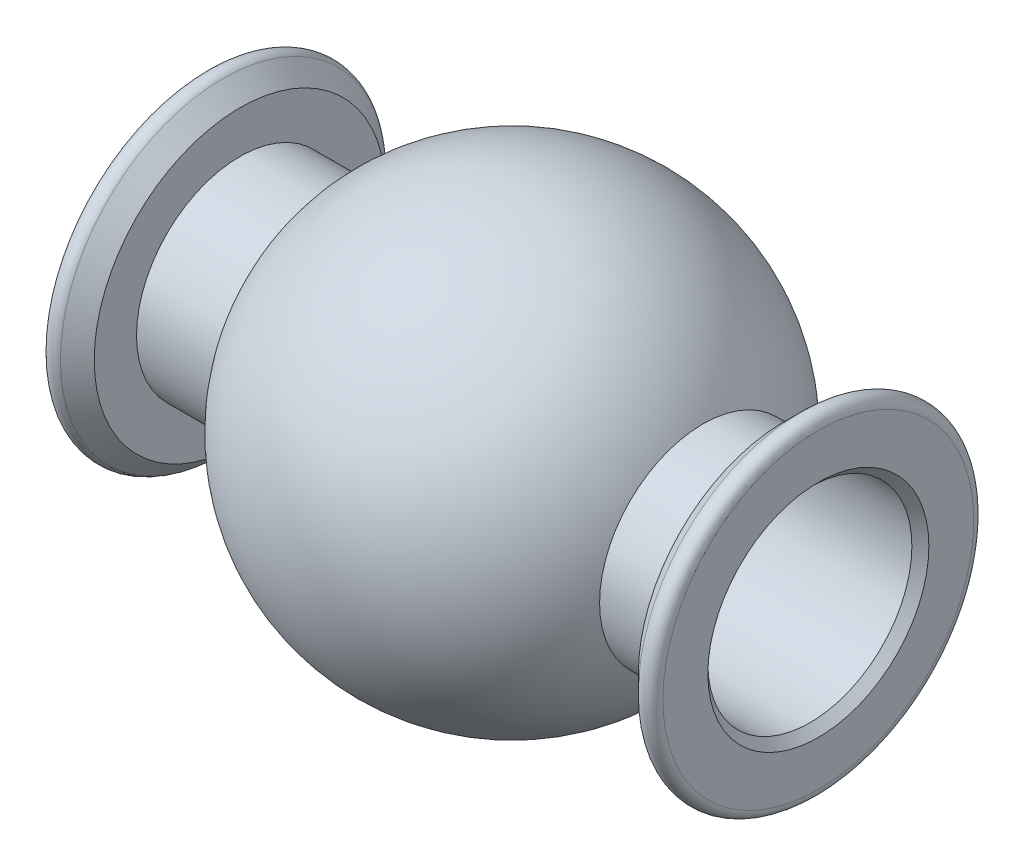
ISO-10303-21;
HEADER;
FILE_DESCRIPTION(('STEP AP214'),'2;1');
FILE_NAME('part.step','',(''),(''),'','','');
FILE_SCHEMA(('AUTOMOTIVE_DESIGN { 1 0 10303 214 1 1 1 1 }'));
ENDSEC;
DATA;
#1=APPLICATION_CONTEXT('core data for automotive mechanical design processes');
#2=APPLICATION_PROTOCOL_DEFINITION('international standard','automotive_design',2000,#1);
#3=PRODUCT_CONTEXT('',#1,'mechanical');
#4=PRODUCT('Part','Part','',(#3));
#5=PRODUCT_RELATED_PRODUCT_CATEGORY('part','',(#4));
#6=PRODUCT_DEFINITION_FORMATION('','',#4);
#7=PRODUCT_DEFINITION_CONTEXT('part definition',#1,'design');
#8=PRODUCT_DEFINITION('design','',#6,#7);
#9=PRODUCT_DEFINITION_SHAPE('','',#8);
#10=(LENGTH_UNIT() NAMED_UNIT(*) SI_UNIT(.MILLI.,.METRE.));
#11=(NAMED_UNIT(*) PLANE_ANGLE_UNIT() SI_UNIT($,.RADIAN.));
#12=(NAMED_UNIT(*) SI_UNIT($,.STERADIAN.) SOLID_ANGLE_UNIT());
#13=UNCERTAINTY_MEASURE_WITH_UNIT(LENGTH_MEASURE(1.E-05),#10,'distance_accuracy_value','');
#14=(GEOMETRIC_REPRESENTATION_CONTEXT(3) GLOBAL_UNCERTAINTY_ASSIGNED_CONTEXT((#13)) GLOBAL_UNIT_ASSIGNED_CONTEXT((#10,
#11,#12)) REPRESENTATION_CONTEXT('',''));
#15=CARTESIAN_POINT('',(0.,0.,0.));
#16=DIRECTION('',(0.,0.,1.));
#17=DIRECTION('',(1.,0.,0.));
#18=AXIS2_PLACEMENT_3D('',#15,#16,#17);
#19=CARTESIAN_POINT('',(0.504672514752433,12.,0.));
#20=DIRECTION('',(1.,0.,0.));
#21=DIRECTION('',(0.,0.,-1.));
#22=AXIS2_PLACEMENT_3D('',#19,#20,#21);
#23=CONICAL_SURFACE('',#22,2.74532748524757,0.785398163397447);
#24=CARTESIAN_POINT('',(0.759345029504866,12.,0.));
#25=DIRECTION('',(1.,0.,0.));
#26=DIRECTION('',(0.,0.,-1.));
#27=AXIS2_PLACEMENT_3D('',#24,#25,#26);
#28=CIRCLE('',#27,3.);
#29=CARTESIAN_POINT('',(0.759345029504865,12.,-3.));
#30=VERTEX_POINT('',#29);
#31=EDGE_CURVE('E75',#30,#30,#28,.F.);
#32=ORIENTED_EDGE('',*,*,#31,.T.);
#33=EDGE_LOOP('',(#32));
#34=FACE_BOUND('',#33,.T.);
#35=CARTESIAN_POINT('',(1.00934502950487,12.,0.));
#36=DIRECTION('',(-1.,0.,0.));
#37=DIRECTION('',(0.,0.,1.));
#38=AXIS2_PLACEMENT_3D('',#35,#36,#37);
#39=CIRCLE('',#38,3.25);
#40=CARTESIAN_POINT('',(1.00934502950487,12.,3.25));
#41=VERTEX_POINT('',#40);
#42=EDGE_CURVE('E10',#41,#41,#39,.T.);
#43=ORIENTED_EDGE('',*,*,#42,.F.);
#44=EDGE_LOOP('',(#43));
#45=FACE_BOUND('',#44,.T.);
#46=ADVANCED_FACE('F32',(#34,#45),#23,.F.);
#47=CARTESIAN_POINT('',(1.00934502950487,16.5707415792916,0.));
#48=DIRECTION('',(-1.,0.,0.));
#49=DIRECTION('',(0.,0.,1.));
#50=AXIS2_PLACEMENT_3D('',#47,#48,#49);
#51=PLANE('',#50);
#52=CARTESIAN_POINT('',(1.00934502950487,12.,0.));
#53=DIRECTION('',(-1.,0.,0.));
#54=DIRECTION('',(0.,0.,1.));
#55=AXIS2_PLACEMENT_3D('',#52,#53,#54);
#56=CIRCLE('',#55,4.57074157929156);
#57=CARTESIAN_POINT('',(1.00934502950487,12.,4.57074157929156));
#58=VERTEX_POINT('',#57);
#59=EDGE_CURVE('E39',#58,#58,#56,.T.);
#60=ORIENTED_EDGE('',*,*,#59,.F.);
#61=EDGE_LOOP('',(#60));
#62=FACE_BOUND('',#61,.T.);
#63=ORIENTED_EDGE('',*,*,#42,.T.);
#64=EDGE_LOOP('',(#63));
#65=FACE_BOUND('',#64,.T.);
#66=ADVANCED_FACE('F95',(#62,#65),#51,.F.);
#67=CARTESIAN_POINT('',(0.709345029504866,12.,0.));
#68=DIRECTION('',(-1.,0.,0.));
#69=DIRECTION('',(0.,0.,1.));
#70=AXIS2_PLACEMENT_3D('',#67,#68,#69);
#71=TOROIDAL_SURFACE('',#70,4.57074157929156,0.3);
#72=CARTESIAN_POINT('',(0.497212995148898,12.,0.));
#73=DIRECTION('',(-1.,0.,0.));
#74=DIRECTION('',(0.,0.,1.));
#75=AXIS2_PLACEMENT_3D('',#72,#73,#74);
#76=CIRCLE('',#75,4.78287361364752);
#77=CARTESIAN_POINT('',(0.497212995148898,12.,4.78287361364752));
#78=VERTEX_POINT('',#77);
#79=EDGE_CURVE('E43',#78,#78,#76,.T.);
#80=ORIENTED_EDGE('',*,*,#79,.F.);
#81=EDGE_LOOP('',(#80));
#82=FACE_BOUND('',#81,.T.);
#83=ORIENTED_EDGE('',*,*,#59,.T.);
#84=EDGE_LOOP('',(#83));
#85=FACE_BOUND('',#84,.T.);
#86=ADVANCED_FACE('F99',(#82,#85),#71,.T.);
#87=CARTESIAN_POINT('',(0.497212995148898,12.,0.));
#88=DIRECTION('',(1.,0.,0.));
#89=DIRECTION('',(0.,0.,-1.));
#90=AXIS2_PLACEMENT_3D('',#87,#88,#89);
#91=CONICAL_SURFACE('',#90,4.78287361364752,0.785398163397448);
#92=CARTESIAN_POINT('',(0.,12.,0.));
#93=DIRECTION('',(-1.,0.,0.));
#94=DIRECTION('',(0.,0.,1.));
#95=AXIS2_PLACEMENT_3D('',#92,#93,#94);
#96=CIRCLE('',#95,4.28566061849863);
#97=CARTESIAN_POINT('',(0.,12.,4.28566061849863));
#98=VERTEX_POINT('',#97);
#99=EDGE_CURVE('E48',#98,#98,#96,.T.);
#100=ORIENTED_EDGE('',*,*,#99,.F.);
#101=EDGE_LOOP('',(#100));
#102=FACE_BOUND('',#101,.T.);
#103=ORIENTED_EDGE('',*,*,#79,.T.);
#104=EDGE_LOOP('',(#103));
#105=FACE_BOUND('',#104,.T.);
#106=ADVANCED_FACE('F105',(#102,#105),#91,.T.);
#107=CARTESIAN_POINT('',(0.,15.0434493191754,0.));
#108=DIRECTION('',(1.,0.,0.));
#109=DIRECTION('',(0.,0.,-1.));
#110=AXIS2_PLACEMENT_3D('',#107,#108,#109);
#111=PLANE('',#110);
#112=CARTESIAN_POINT('',(0.,12.,0.));
#113=DIRECTION('',(-1.,0.,0.));
#114=DIRECTION('',(0.,0.,1.));
#115=AXIS2_PLACEMENT_3D('',#112,#113,#114);
#116=CIRCLE('',#115,3.04344931917541);
#117=CARTESIAN_POINT('',(0.,12.,3.04344931917541));
#118=VERTEX_POINT('',#117);
#119=EDGE_CURVE('E51',#118,#118,#116,.T.);
#120=ORIENTED_EDGE('',*,*,#119,.F.);
#121=EDGE_LOOP('',(#120));
#122=FACE_BOUND('',#121,.T.);
#123=ORIENTED_EDGE('',*,*,#99,.T.);
#124=EDGE_LOOP('',(#123));
#125=FACE_BOUND('',#124,.T.);
#126=ADVANCED_FACE('F112',(#122,#125),#111,.F.);
#127=CARTESIAN_POINT('',(-16.5046725147524,12.,0.));
#128=DIRECTION('',(-1.,0.,0.));
#129=DIRECTION('',(0.,0.,1.));
#130=AXIS2_PLACEMENT_3D('',#127,#128,#129);
#131=CYLINDRICAL_SURFACE('',#130,3.04344931917541);
#132=CARTESIAN_POINT('',(-2.38132433383001,12.,0.));
#133=DIRECTION('',(-1.,0.,0.));
#134=DIRECTION('',(0.,0.,1.));
#135=AXIS2_PLACEMENT_3D('',#132,#133,#134);
#136=CIRCLE('',#135,3.04344931917541);
#137=CARTESIAN_POINT('',(-2.38132433383001,15.0434493191754,0.));
#138=VERTEX_POINT('',#137);
#139=EDGE_CURVE('E54',#138,#138,#136,.T.);
#140=ORIENTED_EDGE('',*,*,#139,.F.);
#141=EDGE_LOOP('',(#140));
#142=FACE_BOUND('',#141,.T.);
#143=ORIENTED_EDGE('',*,*,#119,.T.);
#144=EDGE_LOOP('',(#143));
#145=FACE_BOUND('',#144,.T.);
#146=ADVANCED_FACE('F116',(#142,#145),#131,.T.);
#147=CARTESIAN_POINT('',(-8.,12.,0.));
#148=DIRECTION('',(-1.,0.,0.));
#149=DIRECTION('',(0.,1.,0.));
#150=AXIS2_PLACEMENT_3D('',#147,#148,#149);
#151=SPHERICAL_SURFACE('',#150,6.39);
#152=CARTESIAN_POINT('',(-13.61867566617,12.,0.));
#153=DIRECTION('',(-1.,0.,0.));
#154=DIRECTION('',(0.,0.,1.));
#155=AXIS2_PLACEMENT_3D('',#152,#153,#154);
#156=CIRCLE('',#155,3.04344931917541);
#157=CARTESIAN_POINT('',(-13.61867566617,15.0434493191754,0.));
#158=VERTEX_POINT('',#157);
#159=EDGE_CURVE('E57',#158,#158,#156,.T.);
#160=CARTESIAN_POINT('',(-13.61867566617,15.0434493191754,0.));
#161=CARTESIAN_POINT('',(-13.5505613818728,15.1692150556261,0.));
#162=CARTESIAN_POINT('',(-13.4782117842726,15.2926856363456,0.));
#163=CARTESIAN_POINT('',(-13.3253969060577,15.5344982095911,0.));
#164=CARTESIAN_POINT('',(-13.244931625443,15.6528402021171,0.));
#165=CARTESIAN_POINT('',(-13.0762403247902,15.8838573222447,0.));
#166=CARTESIAN_POINT('',(-12.9880143047521,15.9965324498463,0.));
#167=CARTESIAN_POINT('',(-12.804201249431,16.2157092989343,0.));
#168=CARTESIAN_POINT('',(-12.708614214148,16.3222110204208,0.));
#169=CARTESIAN_POINT('',(-12.5105094038746,16.5285606812796,0.));
#170=CARTESIAN_POINT('',(-12.4079916288842,16.6284086206519,0.));
#171=CARTESIAN_POINT('',(-12.1964875567143,16.8210007759508,0.));
#172=CARTESIAN_POINT('',(-12.0875012595348,16.9137449918772,0.));
#173=CARTESIAN_POINT('',(-11.863551326915,17.091711657747,0.));
#174=CARTESIAN_POINT('',(-11.7485876914747,17.1769341076904,0.));
#175=CARTESIAN_POINT('',(-11.5132012578846,17.3394731331388,0.));
#176=CARTESIAN_POINT('',(-11.3927784597348,17.4167897086439,0.));
#177=CARTESIAN_POINT('',(-11.1470164683144,17.5631685016164,0.));
#178=CARTESIAN_POINT('',(-11.0216772750438,17.6322307190838,0.));
#179=CARTESIAN_POINT('',(-10.7666474238072,17.7617895187722,0.));
#180=CARTESIAN_POINT('',(-10.6369567658411,17.8222861009931,0.));
#181=CARTESIAN_POINT('',(-10.3738085276181,17.9344409594546,0.));
#182=CARTESIAN_POINT('',(-10.240350947361,17.9860992356952,0.));
#183=CARTESIAN_POINT('',(-9.97027038551857,18.0803446476989,0.));
#184=CARTESIAN_POINT('',(-9.83364740393312,18.1229317834621,0.));
#185=CARTESIAN_POINT('',(-9.55785182744478,18.1988429654758,0.));
#186=CARTESIAN_POINT('',(-9.41867923254189,18.2321670117262,0.));
#187=CARTESIAN_POINT('',(-9.13841170908273,18.2894018163505,0.));
#188=CARTESIAN_POINT('',(-8.99731678052647,18.3133125747242,0.));
#189=CARTESIAN_POINT('',(-8.71384053377487,18.3516130328628,0.));
#190=CARTESIAN_POINT('',(-8.57145921557952,18.3660027326275,0.));
#191=CARTESIAN_POINT('',(-8.28605193158945,18.3851962161961,0.));
#192=CARTESIAN_POINT('',(-8.14302596579472,18.39,0.));
#193=CARTESIAN_POINT('',(-7.85697403420527,18.39,0.));
#194=CARTESIAN_POINT('',(-7.71394806841055,18.3851962161961,0.));
#195=CARTESIAN_POINT('',(-7.42854078442048,18.3660027326275,0.));
#196=CARTESIAN_POINT('',(-7.28615946622513,18.3516130328628,0.));
#197=CARTESIAN_POINT('',(-7.00268321947353,18.3133125747242,0.));
#198=CARTESIAN_POINT('',(-6.86158829091726,18.2894018163505,0.));
#199=CARTESIAN_POINT('',(-6.58132076745811,18.2321670117262,0.));
#200=CARTESIAN_POINT('',(-6.44214817255522,18.1988429654758,0.));
#201=CARTESIAN_POINT('',(-6.16635259606687,18.1229317834621,0.));
#202=CARTESIAN_POINT('',(-6.02972961448142,18.0803446476989,0.));
#203=CARTESIAN_POINT('',(-5.75964905263896,17.9860992356952,0.));
#204=CARTESIAN_POINT('',(-5.62619147238194,17.9344409594546,0.));
#205=CARTESIAN_POINT('',(-5.36304323415888,17.8222861009931,0.));
#206=CARTESIAN_POINT('',(-5.23335257619283,17.7617895187722,0.));
#207=CARTESIAN_POINT('',(-4.97832272495618,17.6322307190838,0.));
#208=CARTESIAN_POINT('',(-4.85298353168558,17.5631685016164,0.));
#209=CARTESIAN_POINT('',(-4.6072215402652,17.4167897086439,0.));
#210=CARTESIAN_POINT('',(-4.48679874211543,17.3394731331388,0.));
#211=CARTESIAN_POINT('',(-4.25141230852534,17.1769341076904,0.));
#212=CARTESIAN_POINT('',(-4.13644867308502,17.091711657747,0.));
#213=CARTESIAN_POINT('',(-3.91249874046521,16.9137449918772,0.));
#214=CARTESIAN_POINT('',(-3.80351244328571,16.8210007759508,0.));
#215=CARTESIAN_POINT('',(-3.59200837111582,16.6284086206519,0.));
#216=CARTESIAN_POINT('',(-3.48949059612543,16.5285606812796,0.));
#217=CARTESIAN_POINT('',(-3.29138578585202,16.3222110204208,0.));
#218=CARTESIAN_POINT('',(-3.195798750569,16.2157092989343,0.));
#219=CARTESIAN_POINT('',(-3.01198569524791,15.9965324498463,0.));
#220=CARTESIAN_POINT('',(-2.92375967520984,15.8838573222447,0.));
#221=CARTESIAN_POINT('',(-2.75506837455702,15.6528402021171,0.));
#222=CARTESIAN_POINT('',(-2.67460309394227,15.5344982095911,0.));
#223=CARTESIAN_POINT('',(-2.52178821572738,15.2926856363456,0.));
#224=CARTESIAN_POINT('',(-2.44943861812723,15.1692150556261,0.));
#225=CARTESIAN_POINT('',(-2.38132433383001,15.0434493191754,0.));
#226=B_SPLINE_CURVE_WITH_KNOTS('',3,(#160,#161,#162,#163,#164,#165,#166,#167,#168,#169,#170,
#171,#172,#173,#174,#175,#176,#177,#178,#179,#180,#181,#182,#183,#184,#185,#186,#187,#188,#189,
#190,#191,#192,#193,#194,#195,#196,#197,#198,#199,#200,#201,#202,#203,#204,#205,#206,#207,#208,
#209,#210,#211,#212,#213,#214,#215,#216,#217,#218,#219,#220,#221,#222,#223,#224,#225),
.UNSPECIFIED.,.F.,.F.,(4,2,2,2,2,2,2,2,2,2,2,2,2,2,2,2,2,2,2,2,2,2,2,2,2,2,2,2,2,2,2,2,4),(0.,
0.428997339172375,0.857994678344751,1.28699201751713,1.7159893566895,2.14498669586187,
2.57398403503425,3.00298137420663,3.431978713379,3.86097605255138,4.28997339172375,
4.71897073089613,5.1479680700685,5.57696540924088,6.00596274841325,6.43496008758563,
6.863957426758,7.29295476593038,7.72195210510275,8.15094944427513,8.5799467834475,
9.00894412261988,9.43794146179225,9.86693880096463,10.295936140137,10.7249334793094,
11.1539308184818,11.5829281576541,12.0119254968265,12.4409228359989,12.8699201751713,
13.2989175143436,13.727914853516),.UNSPECIFIED.);
#227=EDGE_CURVE('BSEAM120',#158,#138,#226,.T.);
#228=ORIENTED_EDGE('',*,*,#159,.F.);
#229=ORIENTED_EDGE('',*,*,#139,.T.);
#230=ORIENTED_EDGE('',*,*,#227,.T.);
#231=ORIENTED_EDGE('',*,*,#227,.F.);
#232=EDGE_LOOP('',(#228,#230,#229,#231));
#233=FACE_BOUND('',#232,.T.);
#234=ADVANCED_FACE('F120',(#233),#151,.T.);
#235=CARTESIAN_POINT('',(-16.5046725147524,12.,0.));
#236=DIRECTION('',(-1.,0.,0.));
#237=DIRECTION('',(0.,0.,1.));
#238=AXIS2_PLACEMENT_3D('',#235,#236,#237);
#239=CYLINDRICAL_SURFACE('',#238,3.04344931917541);
#240=CARTESIAN_POINT('',(-16.,12.,0.));
#241=DIRECTION('',(-1.,0.,0.));
#242=DIRECTION('',(0.,0.,1.));
#243=AXIS2_PLACEMENT_3D('',#240,#241,#242);
#244=CIRCLE('',#243,3.04344931917541);
#245=CARTESIAN_POINT('',(-16.,12.,3.04344931917541));
#246=VERTEX_POINT('',#245);
#247=EDGE_CURVE('E60',#246,#246,#244,.T.);
#248=ORIENTED_EDGE('',*,*,#247,.F.);
#249=EDGE_LOOP('',(#248));
#250=FACE_BOUND('',#249,.T.);
#251=ORIENTED_EDGE('',*,*,#159,.T.);
#252=EDGE_LOOP('',(#251));
#253=FACE_BOUND('',#252,.T.);
#254=ADVANCED_FACE('F124',(#250,#253),#239,.T.);
#255=CARTESIAN_POINT('',(-16.,15.0434493191754,0.));
#256=DIRECTION('',(-1.,0.,0.));
#257=DIRECTION('',(0.,0.,1.));
#258=AXIS2_PLACEMENT_3D('',#255,#256,#257);
#259=PLANE('',#258);
#260=CARTESIAN_POINT('',(-16.,12.,0.));
#261=DIRECTION('',(-1.,0.,0.));
#262=DIRECTION('',(0.,0.,1.));
#263=AXIS2_PLACEMENT_3D('',#260,#261,#262);
#264=CIRCLE('',#263,4.28566061849863);
#265=CARTESIAN_POINT('',(-16.,12.,4.28566061849863));
#266=VERTEX_POINT('',#265);
#267=EDGE_CURVE('E63',#266,#266,#264,.T.);
#268=ORIENTED_EDGE('',*,*,#267,.F.);
#269=EDGE_LOOP('',(#268));
#270=FACE_BOUND('',#269,.T.);
#271=ORIENTED_EDGE('',*,*,#247,.T.);
#272=EDGE_LOOP('',(#271));
#273=FACE_BOUND('',#272,.T.);
#274=ADVANCED_FACE('F128',(#270,#273),#259,.F.);
#275=CARTESIAN_POINT('',(-16.,12.,0.));
#276=DIRECTION('',(-1.,0.,0.));
#277=DIRECTION('',(0.,0.,1.));
#278=AXIS2_PLACEMENT_3D('',#275,#276,#277);
#279=CONICAL_SURFACE('',#278,4.28566061849863,0.785398163397448);
#280=CARTESIAN_POINT('',(-16.4972129951489,12.,0.));
#281=DIRECTION('',(-1.,0.,0.));
#282=DIRECTION('',(0.,0.,1.));
#283=AXIS2_PLACEMENT_3D('',#280,#281,#282);
#284=CIRCLE('',#283,4.78287361364753);
#285=CARTESIAN_POINT('',(-16.4972129951489,12.,4.78287361364753));
#286=VERTEX_POINT('',#285);
#287=EDGE_CURVE('E66',#286,#286,#284,.T.);
#288=ORIENTED_EDGE('',*,*,#287,.F.);
#289=EDGE_LOOP('',(#288));
#290=FACE_BOUND('',#289,.T.);
#291=ORIENTED_EDGE('',*,*,#267,.T.);
#292=EDGE_LOOP('',(#291));
#293=FACE_BOUND('',#292,.T.);
#294=ADVANCED_FACE('F132',(#290,#293),#279,.T.);
#295=CARTESIAN_POINT('',(-16.7093450295049,12.,0.));
#296=DIRECTION('',(-1.,0.,0.));
#297=DIRECTION('',(0.,0.,1.));
#298=AXIS2_PLACEMENT_3D('',#295,#296,#297);
#299=TOROIDAL_SURFACE('',#298,4.57074157929156,0.300000000000002);
#300=CARTESIAN_POINT('',(-17.0093450295049,12.,0.));
#301=DIRECTION('',(-1.,0.,0.));
#302=DIRECTION('',(0.,0.,1.));
#303=AXIS2_PLACEMENT_3D('',#300,#301,#302);
#304=CIRCLE('',#303,4.57074157929156);
#305=CARTESIAN_POINT('',(-17.0093450295049,12.,4.57074157929156));
#306=VERTEX_POINT('',#305);
#307=EDGE_CURVE('E69',#306,#306,#304,.T.);
#308=ORIENTED_EDGE('',*,*,#307,.F.);
#309=EDGE_LOOP('',(#308));
#310=FACE_BOUND('',#309,.T.);
#311=ORIENTED_EDGE('',*,*,#287,.T.);
#312=EDGE_LOOP('',(#311));
#313=FACE_BOUND('',#312,.T.);
#314=ADVANCED_FACE('F136',(#310,#313),#299,.T.);
#315=CARTESIAN_POINT('',(-17.0093450295049,16.5707415792916,0.));
#316=DIRECTION('',(1.,0.,0.));
#317=DIRECTION('',(0.,0.,-1.));
#318=AXIS2_PLACEMENT_3D('',#315,#316,#317);
#319=PLANE('',#318);
#320=CARTESIAN_POINT('',(-17.0093450295049,12.,0.));
#321=DIRECTION('',(-1.,0.,0.));
#322=DIRECTION('',(0.,0.,1.));
#323=AXIS2_PLACEMENT_3D('',#320,#321,#322);
#324=CIRCLE('',#323,3.25);
#325=CARTESIAN_POINT('',(-17.0093450295049,12.,3.25));
#326=VERTEX_POINT('',#325);
#327=EDGE_CURVE('E72',#326,#326,#324,.T.);
#328=ORIENTED_EDGE('',*,*,#327,.F.);
#329=EDGE_LOOP('',(#328));
#330=FACE_BOUND('',#329,.T.);
#331=ORIENTED_EDGE('',*,*,#307,.T.);
#332=EDGE_LOOP('',(#331));
#333=FACE_BOUND('',#332,.T.);
#334=ADVANCED_FACE('F92',(#330,#333),#319,.F.);
#335=CARTESIAN_POINT('',(-17.0093450295049,12.,0.));
#336=DIRECTION('',(-1.,0.,0.));
#337=DIRECTION('',(0.,0.,1.));
#338=AXIS2_PLACEMENT_3D('',#335,#336,#337);
#339=CONICAL_SURFACE('',#338,3.25,0.785398163397445);
#340=CARTESIAN_POINT('',(-16.7593450295049,12.,0.));
#341=DIRECTION('',(-1.,0.,0.));
#342=DIRECTION('',(0.,0.,1.));
#343=AXIS2_PLACEMENT_3D('',#340,#341,#342);
#344=CIRCLE('',#343,3.);
#345=CARTESIAN_POINT('',(-16.7593450295049,12.,-3.));
#346=VERTEX_POINT('',#345);
#347=EDGE_CURVE('E35',#346,#346,#344,.F.);
#348=ORIENTED_EDGE('',*,*,#347,.T.);
#349=EDGE_LOOP('',(#348));
#350=FACE_BOUND('',#349,.T.);
#351=ORIENTED_EDGE('',*,*,#327,.T.);
#352=EDGE_LOOP('',(#351));
#353=FACE_BOUND('',#352,.T.);
#354=ADVANCED_FACE('F82',(#350,#353),#339,.F.);
#355=CARTESIAN_POINT('',(-22.9906549704951,12.,0.));
#356=DIRECTION('',(1.,0.,0.));
#357=DIRECTION('',(0.,0.,-1.));
#358=AXIS2_PLACEMENT_3D('',#355,#356,#357);
#359=CYLINDRICAL_SURFACE('',#358,3.);
#360=CARTESIAN_POINT('',(-16.7593450295049,12.,-3.));
#361=CARTESIAN_POINT('',(-16.5768586747235,12.,-3.));
#362=CARTESIAN_POINT('',(-16.3943723199422,12.,-3.));
#363=CARTESIAN_POINT('',(-16.0293996103795,12.,-3.));
#364=CARTESIAN_POINT('',(-15.8469132555981,12.,-3.));
#365=CARTESIAN_POINT('',(-15.4819405460354,12.,-3.));
#366=CARTESIAN_POINT('',(-15.2994541912541,12.,-3.));
#367=CARTESIAN_POINT('',(-14.9344814816914,12.,-3.));
#368=CARTESIAN_POINT('',(-14.75199512691,12.,-3.));
#369=CARTESIAN_POINT('',(-14.3870224173473,12.,-3.));
#370=CARTESIAN_POINT('',(-14.2045360625659,12.,-3.));
#371=CARTESIAN_POINT('',(-13.8395633530032,12.,-3.));
#372=CARTESIAN_POINT('',(-13.6570769982219,12.,-3.));
#373=CARTESIAN_POINT('',(-13.2921042886592,12.,-3.));
#374=CARTESIAN_POINT('',(-13.1096179338778,12.,-3.));
#375=CARTESIAN_POINT('',(-12.7446452243151,12.,-3.));
#376=CARTESIAN_POINT('',(-12.5621588695338,12.,-3.));
#377=CARTESIAN_POINT('',(-12.1971861599711,12.,-3.));
#378=CARTESIAN_POINT('',(-12.0146998051897,12.,-3.));
#379=CARTESIAN_POINT('',(-11.649727095627,12.,-3.));
#380=CARTESIAN_POINT('',(-11.4672407408457,12.,-3.));
#381=CARTESIAN_POINT('',(-11.102268031283,12.,-3.));
#382=CARTESIAN_POINT('',(-10.9197816765016,12.,-3.));
#383=CARTESIAN_POINT('',(-10.5548089669389,12.,-3.));
#384=CARTESIAN_POINT('',(-10.3723226121576,12.,-3.));
#385=CARTESIAN_POINT('',(-10.0073499025949,12.,-3.));
#386=CARTESIAN_POINT('',(-9.82486354781351,12.,-3.));
#387=CARTESIAN_POINT('',(-9.45989083825081,12.,-3.));
#388=CARTESIAN_POINT('',(-9.27740448346946,12.,-3.));
#389=CARTESIAN_POINT('',(-8.91243177390676,12.,-3.));
#390=CARTESIAN_POINT('',(-8.7299454191254,12.,-3.));
#391=CARTESIAN_POINT('',(-8.3649727095627,12.,-3.));
#392=CARTESIAN_POINT('',(-8.18248635478135,12.,-3.));
#393=CARTESIAN_POINT('',(-7.81751364521865,12.,-3.));
#394=CARTESIAN_POINT('',(-7.6350272904373,12.,-3.));
#395=CARTESIAN_POINT('',(-7.27005458087459,12.,-3.));
#396=CARTESIAN_POINT('',(-7.08756822609324,12.,-3.));
#397=CARTESIAN_POINT('',(-6.72259551653054,12.,-3.));
#398=CARTESIAN_POINT('',(-6.54010916174919,12.,-3.));
#399=CARTESIAN_POINT('',(-6.17513645218649,12.,-3.));
#400=CARTESIAN_POINT('',(-5.99265009740513,12.,-3.));
#401=CARTESIAN_POINT('',(-5.62767738784243,12.,-3.));
#402=CARTESIAN_POINT('',(-5.44519103306108,12.,-3.));
#403=CARTESIAN_POINT('',(-5.08021832349838,12.,-3.));
#404=CARTESIAN_POINT('',(-4.89773196871703,12.,-3.));
#405=CARTESIAN_POINT('',(-4.53275925915433,12.,-3.));
#406=CARTESIAN_POINT('',(-4.35027290437297,12.,-3.));
#407=CARTESIAN_POINT('',(-3.98530019481027,12.,-3.));
#408=CARTESIAN_POINT('',(-3.80281384002892,12.,-3.));
#409=CARTESIAN_POINT('',(-3.43784113046622,12.,-3.));
#410=CARTESIAN_POINT('',(-3.25535477568486,12.,-3.));
#411=CARTESIAN_POINT('',(-2.89038206612216,12.,-3.));
#412=CARTESIAN_POINT('',(-2.70789571134081,12.,-3.));
#413=CARTESIAN_POINT('',(-2.34292300177811,12.,-3.));
#414=CARTESIAN_POINT('',(-2.16043664699676,12.,-3.));
#415=CARTESIAN_POINT('',(-1.79546393743405,12.,-3.));
#416=CARTESIAN_POINT('',(-1.6129775826527,12.,-3.));
#417=CARTESIAN_POINT('',(-1.24800487309,12.,-3.));
#418=CARTESIAN_POINT('',(-1.06551851830865,12.,-3.));
#419=CARTESIAN_POINT('',(-0.700545808745947,12.,-3.));
#420=CARTESIAN_POINT('',(-0.518059453964595,12.,-3.));
#421=CARTESIAN_POINT('',(-0.153086744401892,12.,-3.));
#422=CARTESIAN_POINT('',(0.0293996103794594,12.,-3.));
#423=CARTESIAN_POINT('',(0.394372319942162,12.,-3.));
#424=CARTESIAN_POINT('',(0.576858674723514,12.,-3.));
#425=CARTESIAN_POINT('',(0.759345029504865,12.,-3.));
#426=B_SPLINE_CURVE_WITH_KNOTS('',3,(#360,#361,#362,#363,#364,#365,#366,#367,#368,#369,#370,
#371,#372,#373,#374,#375,#376,#377,#378,#379,#380,#381,#382,#383,#384,#385,#386,#387,#388,#389,
#390,#391,#392,#393,#394,#395,#396,#397,#398,#399,#400,#401,#402,#403,#404,#405,#406,#407,#408,
#409,#410,#411,#412,#413,#414,#415,#416,#417,#418,#419,#420,#421,#422,#423,#424,#425),
.UNSPECIFIED.,.F.,.F.,(4,2,2,2,2,2,2,2,2,2,2,2,2,2,2,2,2,2,2,2,2,2,2,2,2,2,2,2,2,2,2,2,4),(0.,
0.547459064344055,1.09491812868811,1.64237719303216,2.18983625737621,2.73729532172027,
3.28475438606432,3.83221345040838,4.37967251475243,4.92713157909649,5.47459064344054,
6.02204970778459,6.56950877212865,7.1169678364727,7.66442690081676,8.21188596516081,
8.75934502950486,9.30680409384892,9.85426315819297,10.401722222537,10.9491812868811,
11.4966403512251,12.0440994155692,12.5915584799132,13.1390175442573,13.6864766086013,
14.2339356729454,14.7813947372895,15.3288538016335,15.8763128659776,16.4237719303216,
16.9712309946657,17.5186900590097),.UNSPECIFIED.);
#427=EDGE_CURVE('BSEAM85',#346,#30,#426,.T.);
#428=ORIENTED_EDGE('',*,*,#347,.F.);
#429=ORIENTED_EDGE('',*,*,#31,.F.);
#430=ORIENTED_EDGE('',*,*,#427,.T.);
#431=ORIENTED_EDGE('',*,*,#427,.F.);
#432=EDGE_LOOP('',(#428,#430,#429,#431));
#433=FACE_BOUND('',#432,.T.);
#434=ADVANCED_FACE('F85',(#433),#359,.F.);
#435=CLOSED_SHELL('',(#46,#66,#86,#106,#126,#146,#234,#254,#274,#294,#314,#334,#354,#434));
#436=MANIFOLD_SOLID_BREP('B2',#435);
#437=ADVANCED_BREP_SHAPE_REPRESENTATION('',(#18,#436),#14);
#438=SHAPE_DEFINITION_REPRESENTATION(#9,#437);
ENDSEC;
END-ISO-10303-21;
